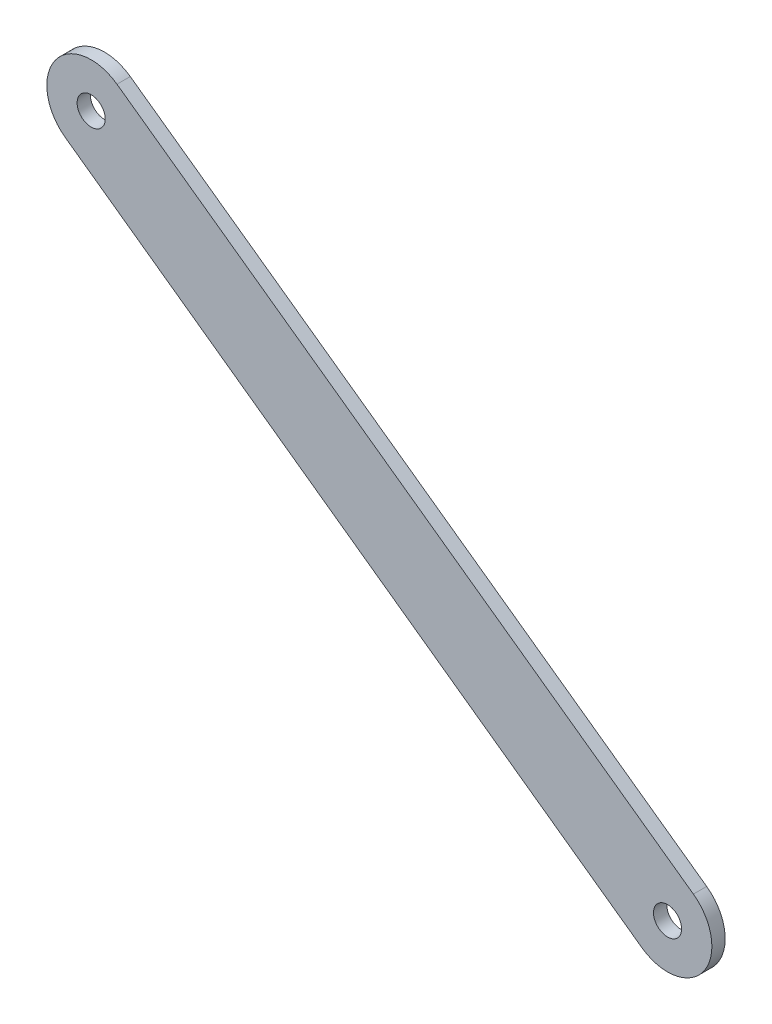
ISO-10303-21;
HEADER;
FILE_DESCRIPTION(('STEP AP214'),'2;1');
FILE_NAME('part.step','',(''),(''),'','','');
FILE_SCHEMA(('AUTOMOTIVE_DESIGN { 1 0 10303 214 1 1 1 1 }'));
ENDSEC;
DATA;
#1=APPLICATION_CONTEXT('core data for automotive mechanical design processes');
#2=APPLICATION_PROTOCOL_DEFINITION('international standard','automotive_design',2000,#1);
#3=PRODUCT_CONTEXT('',#1,'mechanical');
#4=PRODUCT('Part','Part','',(#3));
#5=PRODUCT_RELATED_PRODUCT_CATEGORY('part','',(#4));
#6=PRODUCT_DEFINITION_FORMATION('','',#4);
#7=PRODUCT_DEFINITION_CONTEXT('part definition',#1,'design');
#8=PRODUCT_DEFINITION('design','',#6,#7);
#9=PRODUCT_DEFINITION_SHAPE('','',#8);
#10=(LENGTH_UNIT() NAMED_UNIT(*) SI_UNIT(.MILLI.,.METRE.));
#11=(NAMED_UNIT(*) PLANE_ANGLE_UNIT() SI_UNIT($,.RADIAN.));
#12=(NAMED_UNIT(*) SI_UNIT($,.STERADIAN.) SOLID_ANGLE_UNIT());
#13=UNCERTAINTY_MEASURE_WITH_UNIT(LENGTH_MEASURE(1.E-05),#10,'distance_accuracy_value','');
#14=(GEOMETRIC_REPRESENTATION_CONTEXT(3) GLOBAL_UNCERTAINTY_ASSIGNED_CONTEXT((#13)) GLOBAL_UNIT_ASSIGNED_CONTEXT((#10,
#11,#12)) REPRESENTATION_CONTEXT('',''));
#15=CARTESIAN_POINT('',(0.,0.,0.));
#16=DIRECTION('',(0.,0.,1.));
#17=DIRECTION('',(1.,0.,0.));
#18=AXIS2_PLACEMENT_3D('',#15,#16,#17);
#19=CARTESIAN_POINT('',(54.8139379488304,76.467401834389,3.));
#20=DIRECTION('',(0.582605310162296,0.812755223035014,0.));
#21=DIRECTION('',(-0.812755223035014,0.582605310162296,0.));
#22=AXIS2_PLACEMENT_3D('',#19,#20,#21);
#23=PLANE('',#22);
#24=DIRECTION('',(0.812755223035014,-0.582605310162296,0.));
#25=VECTOR('',#24,1.);
#26=CARTESIAN_POINT('',(54.8139379488304,76.467401834389,0.));
#27=LINE('',#26,#25);
#28=CARTESIAN_POINT('',(77.5749982751918,60.1516474285988,0.));
#29=VERTEX_POINT('',#28);
#30=CARTESIAN_POINT('',(207.615833960794,-33.0652021973685,0.));
#31=VERTEX_POINT('',#30);
#32=EDGE_CURVE('E108',#29,#31,#27,.T.);
#33=ORIENTED_EDGE('',*,*,#32,.T.);
#34=DIRECTION('',(0.,0.,-1.));
#35=VECTOR('',#34,1.);
#36=CARTESIAN_POINT('',(207.615833960794,-33.0652021973685,3.));
#37=LINE('',#36,#35);
#38=CARTESIAN_POINT('',(207.615833960794,-33.0652021973685,3.));
#39=VERTEX_POINT('',#38);
#40=EDGE_CURVE('E11',#39,#31,#37,.T.);
#41=ORIENTED_EDGE('',*,*,#40,.F.);
#42=DIRECTION('',(0.812755223035014,-0.582605310162296,0.));
#43=VECTOR('',#42,1.);
#44=CARTESIAN_POINT('',(54.8139379488304,76.467401834389,3.));
#45=LINE('',#44,#43);
#46=CARTESIAN_POINT('',(77.5749982751918,60.1516474285988,3.));
#47=VERTEX_POINT('',#46);
#48=EDGE_CURVE('E87',#47,#39,#45,.T.);
#49=ORIENTED_EDGE('',*,*,#48,.F.);
#50=DIRECTION('',(0.,0.,-1.));
#51=VECTOR('',#50,1.);
#52=CARTESIAN_POINT('',(77.5749982751918,60.1516474285988,3.));
#53=LINE('',#52,#51);
#54=EDGE_CURVE('E98',#47,#29,#53,.T.);
#55=ORIENTED_EDGE('',*,*,#54,.T.);
#56=EDGE_LOOP('',(#33,#41,#49,#55));
#57=FACE_BOUND('',#56,.T.);
#58=ADVANCED_FACE('F39',(#57),#23,.F.);
#59=CARTESIAN_POINT('',(213.441887062417,-24.9376499670184,3.));
#60=DIRECTION('',(0.,0.,-1.));
#61=DIRECTION('',(-1.,0.,0.));
#62=AXIS2_PLACEMENT_3D('',#59,#60,#61);
#63=CYLINDRICAL_SURFACE('',#62,9.99999999999998);
#64=CARTESIAN_POINT('',(213.441887062417,-24.9376499670184,0.));
#65=DIRECTION('',(0.,0.,1.));
#66=DIRECTION('',(1.,0.,0.));
#67=AXIS2_PLACEMENT_3D('',#64,#65,#66);
#68=CIRCLE('',#67,9.99999999999998);
#69=CARTESIAN_POINT('',(219.26794016404,-16.8100977366683,0.));
#70=VERTEX_POINT('',#69);
#71=EDGE_CURVE('E92',#31,#70,#68,.T.);
#72=ORIENTED_EDGE('',*,*,#71,.T.);
#73=DIRECTION('',(0.,0.,-1.));
#74=VECTOR('',#73,1.);
#75=CARTESIAN_POINT('',(219.26794016404,-16.8100977366683,3.));
#76=LINE('',#75,#74);
#77=CARTESIAN_POINT('',(219.26794016404,-16.8100977366683,3.));
#78=VERTEX_POINT('',#77);
#79=EDGE_CURVE('E48',#78,#70,#76,.T.);
#80=ORIENTED_EDGE('',*,*,#79,.F.);
#81=CARTESIAN_POINT('',(213.441887062417,-24.9376499670184,3.));
#82=DIRECTION('',(0.,0.,1.));
#83=DIRECTION('',(1.,0.,0.));
#84=AXIS2_PLACEMENT_3D('',#81,#82,#83);
#85=CIRCLE('',#84,9.99999999999998);
#86=EDGE_CURVE('E82',#39,#78,#85,.T.);
#87=ORIENTED_EDGE('',*,*,#86,.F.);
#88=ORIENTED_EDGE('',*,*,#40,.T.);
#89=EDGE_LOOP('',(#72,#80,#87,#88));
#90=FACE_BOUND('',#89,.T.);
#91=ADVANCED_FACE('F91',(#90),#63,.T.);
#92=CARTESIAN_POINT('',(66.4660441520763,92.7225062950892,3.));
#93=DIRECTION('',(0.582605310162296,0.812755223035014,0.));
#94=DIRECTION('',(-0.812755223035014,0.582605310162296,0.));
#95=AXIS2_PLACEMENT_3D('',#92,#93,#94);
#96=PLANE('',#95);
#97=DIRECTION('',(0.812755223035014,-0.582605310162296,0.));
#98=VECTOR('',#97,1.);
#99=CARTESIAN_POINT('',(66.4660441520763,92.7225062950892,0.));
#100=LINE('',#99,#98);
#101=CARTESIAN_POINT('',(89.2271044784377,76.4067518892991,0.));
#102=VERTEX_POINT('',#101);
#103=EDGE_CURVE('E112',#102,#70,#100,.T.);
#104=ORIENTED_EDGE('',*,*,#103,.F.);
#105=DIRECTION('',(0.,0.,-1.));
#106=VECTOR('',#105,1.);
#107=CARTESIAN_POINT('',(89.2271044784377,76.4067518892991,3.));
#108=LINE('',#107,#106);
#109=CARTESIAN_POINT('',(89.2271044784377,76.4067518892991,3.));
#110=VERTEX_POINT('',#109);
#111=EDGE_CURVE('E72',#110,#102,#108,.T.);
#112=ORIENTED_EDGE('',*,*,#111,.F.);
#113=DIRECTION('',(0.812755223035014,-0.582605310162296,0.));
#114=VECTOR('',#113,1.);
#115=CARTESIAN_POINT('',(66.4660441520763,92.7225062950892,3.));
#116=LINE('',#115,#114);
#117=EDGE_CURVE('E85',#110,#78,#116,.T.);
#118=ORIENTED_EDGE('',*,*,#117,.T.);
#119=ORIENTED_EDGE('',*,*,#79,.T.);
#120=EDGE_LOOP('',(#104,#112,#118,#119));
#121=FACE_BOUND('',#120,.T.);
#122=ADVANCED_FACE('F96',(#121),#96,.T.);
#123=CARTESIAN_POINT('',(213.441887062417,-24.9376499670184,3.));
#124=DIRECTION('',(0.,0.,-1.));
#125=DIRECTION('',(-1.,0.,0.));
#126=AXIS2_PLACEMENT_3D('',#123,#124,#125);
#127=CYLINDRICAL_SURFACE('',#126,3.1676563891076);
#128=CARTESIAN_POINT('',(213.441887062417,-24.9376499670184,3.));
#129=DIRECTION('',(0.,0.,1.));
#130=DIRECTION('',(1.,0.,0.));
#131=AXIS2_PLACEMENT_3D('',#128,#129,#130);
#132=CIRCLE('',#131,3.1676563891076);
#133=CARTESIAN_POINT('',(216.609543451525,-24.9376499670184,3.));
#134=VERTEX_POINT('',#133);
#135=EDGE_CURVE('E150',#134,#134,#132,.T.);
#136=ORIENTED_EDGE('',*,*,#135,.T.);
#137=EDGE_LOOP('',(#136));
#138=FACE_BOUND('',#137,.T.);
#139=CARTESIAN_POINT('',(213.441887062417,-24.9376499670184,0.));
#140=DIRECTION('',(0.,0.,1.));
#141=DIRECTION('',(1.,0.,0.));
#142=AXIS2_PLACEMENT_3D('',#139,#140,#141);
#143=CIRCLE('',#142,3.1676563891076);
#144=CARTESIAN_POINT('',(216.609543451525,-24.9376499670184,0.));
#145=VERTEX_POINT('',#144);
#146=EDGE_CURVE('E105',#145,#145,#143,.T.);
#147=ORIENTED_EDGE('',*,*,#146,.F.);
#148=EDGE_LOOP('',(#147));
#149=FACE_BOUND('',#148,.T.);
#150=ADVANCED_FACE('F139',(#138,#149),#127,.F.);
#151=CARTESIAN_POINT('',(83.4010513768147,68.2791996589489,3.));
#152=DIRECTION('',(0.,0.,-1.));
#153=DIRECTION('',(-1.,0.,0.));
#154=AXIS2_PLACEMENT_3D('',#151,#152,#153);
#155=CYLINDRICAL_SURFACE('',#154,3.16765638910757);
#156=CARTESIAN_POINT('',(83.4010513768147,68.2791996589489,3.));
#157=DIRECTION('',(0.,0.,1.));
#158=DIRECTION('',(1.,0.,0.));
#159=AXIS2_PLACEMENT_3D('',#156,#157,#158);
#160=CIRCLE('',#159,3.16765638910757);
#161=CARTESIAN_POINT('',(86.5687077659223,68.2791996589489,3.));
#162=VERTEX_POINT('',#161);
#163=EDGE_CURVE('E115',#162,#162,#160,.T.);
#164=ORIENTED_EDGE('',*,*,#163,.T.);
#165=EDGE_LOOP('',(#164));
#166=FACE_BOUND('',#165,.T.);
#167=CARTESIAN_POINT('',(83.4010513768147,68.2791996589489,0.));
#168=DIRECTION('',(0.,0.,1.));
#169=DIRECTION('',(1.,0.,0.));
#170=AXIS2_PLACEMENT_3D('',#167,#168,#169);
#171=CIRCLE('',#170,3.16765638910757);
#172=CARTESIAN_POINT('',(86.5687077659223,68.2791996589489,0.));
#173=VERTEX_POINT('',#172);
#174=EDGE_CURVE('E102',#173,#173,#171,.T.);
#175=ORIENTED_EDGE('',*,*,#174,.F.);
#176=EDGE_LOOP('',(#175));
#177=FACE_BOUND('',#176,.T.);
#178=ADVANCED_FACE('F41',(#166,#177),#155,.F.);
#179=CARTESIAN_POINT('',(83.4010513768147,68.2791996589489,3.));
#180=DIRECTION('',(0.,0.,-1.));
#181=DIRECTION('',(-1.,0.,0.));
#182=AXIS2_PLACEMENT_3D('',#179,#180,#181);
#183=CYLINDRICAL_SURFACE('',#182,9.99999999999999);
#184=CARTESIAN_POINT('',(83.4010513768147,68.2791996589489,0.));
#185=DIRECTION('',(0.,0.,1.));
#186=DIRECTION('',(1.,0.,0.));
#187=AXIS2_PLACEMENT_3D('',#184,#185,#186);
#188=CIRCLE('',#187,9.99999999999999);
#189=EDGE_CURVE('E75',#102,#29,#188,.T.);
#190=ORIENTED_EDGE('',*,*,#189,.T.);
#191=ORIENTED_EDGE('',*,*,#54,.F.);
#192=CARTESIAN_POINT('',(83.4010513768147,68.2791996589489,3.));
#193=DIRECTION('',(0.,0.,1.));
#194=DIRECTION('',(1.,0.,0.));
#195=AXIS2_PLACEMENT_3D('',#192,#193,#194);
#196=CIRCLE('',#195,9.99999999999999);
#197=EDGE_CURVE('E56',#110,#47,#196,.T.);
#198=ORIENTED_EDGE('',*,*,#197,.F.);
#199=ORIENTED_EDGE('',*,*,#111,.T.);
#200=EDGE_LOOP('',(#190,#191,#198,#199));
#201=FACE_BOUND('',#200,.T.);
#202=ADVANCED_FACE('F127',(#201),#183,.T.);
#203=CARTESIAN_POINT('',(0.,0.,3.));
#204=DIRECTION('',(0.,0.,1.));
#205=DIRECTION('',(1.,0.,0.));
#206=AXIS2_PLACEMENT_3D('',#203,#204,#205);
#207=PLANE('',#206);
#208=ORIENTED_EDGE('',*,*,#163,.F.);
#209=EDGE_LOOP('',(#208));
#210=FACE_BOUND('',#209,.T.);
#211=ORIENTED_EDGE('',*,*,#135,.F.);
#212=EDGE_LOOP('',(#211));
#213=FACE_BOUND('',#212,.T.);
#214=ORIENTED_EDGE('',*,*,#48,.T.);
#215=ORIENTED_EDGE('',*,*,#86,.T.);
#216=ORIENTED_EDGE('',*,*,#117,.F.);
#217=ORIENTED_EDGE('',*,*,#197,.T.);
#218=EDGE_LOOP('',(#214,#215,#216,#217));
#219=FACE_BOUND('',#218,.T.);
#220=ADVANCED_FACE('F83',(#210,#213,#219),#207,.T.);
#221=CARTESIAN_POINT('',(0.,0.,0.));
#222=DIRECTION('',(0.,0.,1.));
#223=DIRECTION('',(1.,0.,0.));
#224=AXIS2_PLACEMENT_3D('',#221,#222,#223);
#225=PLANE('',#224);
#226=ORIENTED_EDGE('',*,*,#174,.T.);
#227=EDGE_LOOP('',(#226));
#228=FACE_BOUND('',#227,.T.);
#229=ORIENTED_EDGE('',*,*,#146,.T.);
#230=EDGE_LOOP('',(#229));
#231=FACE_BOUND('',#230,.T.);
#232=ORIENTED_EDGE('',*,*,#32,.F.);
#233=ORIENTED_EDGE('',*,*,#189,.F.);
#234=ORIENTED_EDGE('',*,*,#103,.T.);
#235=ORIENTED_EDGE('',*,*,#71,.F.);
#236=EDGE_LOOP('',(#232,#233,#234,#235));
#237=FACE_BOUND('',#236,.T.);
#238=ADVANCED_FACE('F120',(#228,#231,#237),#225,.F.);
#239=CLOSED_SHELL('',(#58,#91,#122,#150,#178,#202,#220,#238));
#240=MANIFOLD_SOLID_BREP('B2',#239);
#241=ADVANCED_BREP_SHAPE_REPRESENTATION('',(#18,#240),#14);
#242=SHAPE_DEFINITION_REPRESENTATION(#9,#241);
ENDSEC;
END-ISO-10303-21;
